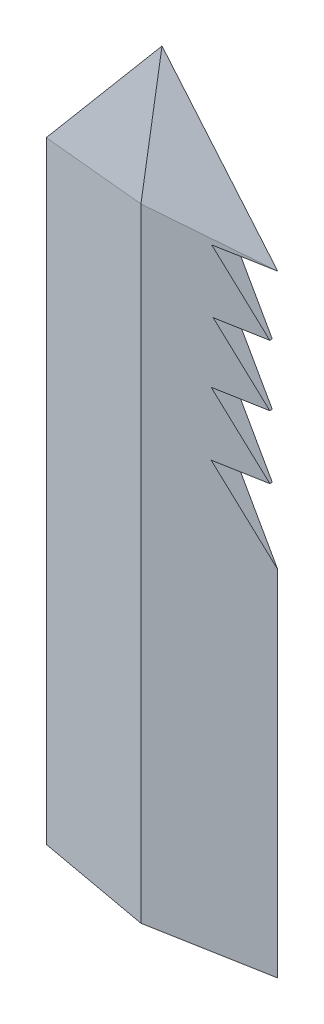
ISO-10303-21;
HEADER;
FILE_DESCRIPTION(('STEP AP214'),'2;1');
FILE_NAME('part.step','',(''),(''),'','','');
FILE_SCHEMA(('AUTOMOTIVE_DESIGN { 1 0 10303 214 1 1 1 1 }'));
ENDSEC;
DATA;
#1=APPLICATION_CONTEXT('core data for automotive mechanical design processes');
#2=APPLICATION_PROTOCOL_DEFINITION('international standard','automotive_design',2000,#1);
#3=PRODUCT_CONTEXT('',#1,'mechanical');
#4=PRODUCT('Part','Part','',(#3));
#5=PRODUCT_RELATED_PRODUCT_CATEGORY('part','',(#4));
#6=PRODUCT_DEFINITION_FORMATION('','',#4);
#7=PRODUCT_DEFINITION_CONTEXT('part definition',#1,'design');
#8=PRODUCT_DEFINITION('design','',#6,#7);
#9=PRODUCT_DEFINITION_SHAPE('','',#8);
#10=(LENGTH_UNIT() NAMED_UNIT(*) SI_UNIT(.MILLI.,.METRE.));
#11=(NAMED_UNIT(*) PLANE_ANGLE_UNIT() SI_UNIT($,.RADIAN.));
#12=(NAMED_UNIT(*) SI_UNIT($,.STERADIAN.) SOLID_ANGLE_UNIT());
#13=UNCERTAINTY_MEASURE_WITH_UNIT(LENGTH_MEASURE(1.E-05),#10,'distance_accuracy_value','');
#14=(GEOMETRIC_REPRESENTATION_CONTEXT(3) GLOBAL_UNCERTAINTY_ASSIGNED_CONTEXT((#13)) GLOBAL_UNIT_ASSIGNED_CONTEXT((#10,
#11,#12)) REPRESENTATION_CONTEXT('',''));
#15=CARTESIAN_POINT('',(0.,0.,0.));
#16=DIRECTION('',(0.,0.,1.));
#17=DIRECTION('',(1.,0.,0.));
#18=AXIS2_PLACEMENT_3D('',#15,#16,#17);
#19=CARTESIAN_POINT('',(49.4049114425268,735.656458749055,0.));
#20=DIRECTION('',(0.178885438199983,0.,0.983869910099907));
#21=DIRECTION('',(0.983869910099907,0.,-0.178885438199983));
#22=AXIS2_PLACEMENT_3D('',#19,#20,#21);
#23=PLANE('',#22);
#24=DIRECTION('',(0.,-1.,0.));
#25=VECTOR('',#24,1.);
#26=CARTESIAN_POINT('',(49.4049114425268,735.656458749055,0.));
#27=LINE('',#26,#25);
#28=CARTESIAN_POINT('',(49.4049114425268,673.557276223925,0.));
#29=VERTEX_POINT('',#28);
#30=CARTESIAN_POINT('',(49.4049114425268,396.497366015123,0.));
#31=VERTEX_POINT('',#30);
#32=EDGE_CURVE('E138',#29,#31,#27,.T.);
#33=ORIENTED_EDGE('',*,*,#32,.F.);
#34=DIRECTION('',(0.979647196162133,0.0925498026063238,-0.178117672029479));
#35=VECTOR('',#34,1.);
#36=CARTESIAN_POINT('',(55.0352055276626,674.089184658141,-1.02368983366106));
#37=LINE('',#36,#35);
#38=CARTESIAN_POINT('',(101.792411442527,678.506458749055,-9.52499999999999));
#39=VERTEX_POINT('',#38);
#40=EDGE_CURVE('E126',#29,#39,#37,.T.);
#41=ORIENTED_EDGE('',*,*,#40,.T.);
#42=DIRECTION('',(0.,-1.,0.));
#43=VECTOR('',#42,1.);
#44=CARTESIAN_POINT('',(101.792411442527,735.656458749055,-9.525));
#45=LINE('',#44,#43);
#46=CARTESIAN_POINT('',(101.792411442527,396.497366015123,-9.525));
#47=VERTEX_POINT('',#46);
#48=EDGE_CURVE('E135',#39,#47,#45,.T.);
#49=ORIENTED_EDGE('',*,*,#48,.T.);
#50=DIRECTION('',(-0.983869910099908,0.,0.178885438199983));
#51=VECTOR('',#50,1.);
#52=CARTESIAN_POINT('',(49.4049114425268,396.497366015123,0.));
#53=LINE('',#52,#51);
#54=EDGE_CURVE('E155',#47,#31,#53,.T.);
#55=ORIENTED_EDGE('',*,*,#54,.T.);
#56=EDGE_LOOP('',(#33,#41,#49,#55));
#57=FACE_BOUND('',#56,.T.);
#58=ADVANCED_FACE('F33',(#57),#23,.F.);
#59=CARTESIAN_POINT('',(101.792411442527,735.656458749055,-9.525));
#60=DIRECTION('',(-0.178885438199983,0.,0.983869910099907));
#61=DIRECTION('',(0.983869910099907,0.,0.178885438199983));
#62=AXIS2_PLACEMENT_3D('',#59,#60,#61);
#63=PLANE('',#62);
#64=DIRECTION('',(-0.979647196162133,0.092549802606325,-0.178117672029479));
#65=VECTOR('',#64,1.);
#66=CARTESIAN_POINT('',(96.6108407054998,678.995975128811,-10.4671037703685));
#67=LINE('',#66,#65);
#68=CARTESIAN_POINT('',(154.179911442527,673.557276223925,0.));
#69=VERTEX_POINT('',#68);
#70=EDGE_CURVE('E139',#69,#39,#67,.T.);
#71=ORIENTED_EDGE('',*,*,#70,.F.);
#72=DIRECTION('',(-0.983869910099908,0.,-0.178885438199983));
#73=VECTOR('',#72,1.);
#74=CARTESIAN_POINT('',(152.503511442527,673.557276223924,-0.304799999999994));
#75=LINE('',#74,#73);
#76=CARTESIAN_POINT('',(128.876006432521,673.557276223924,-4.60071000181918));
#77=VERTEX_POINT('',#76);
#78=EDGE_CURVE('E173',#69,#77,#75,.T.);
#79=ORIENTED_EDGE('',*,*,#78,.T.);
#80=DIRECTION('',(0.614220244823665,-0.781192595146374,0.111676408149757));
#81=VECTOR('',#80,1.);
#82=CARTESIAN_POINT('',(128.538230123855,673.986875139573,-4.66212387612206));
#83=LINE('',#82,#81);
#84=CARTESIAN_POINT('',(151.148766449185,645.229790529464,-0.551117271516697));
#85=VERTEX_POINT('',#84);
#86=EDGE_CURVE('E171',#77,#85,#83,.T.);
#87=ORIENTED_EDGE('',*,*,#86,.T.);
#88=DIRECTION('',(-0.983869910099908,0.,-0.178885438199983));
#89=VECTOR('',#88,1.);
#90=CARTESIAN_POINT('',(149.569363088972,645.229790529464,-0.838281518828162));
#91=LINE('',#90,#89);
#92=CARTESIAN_POINT('',(129.452026088125,645.229790529464,-4.49597915534583));
#93=VERTEX_POINT('',#92);
#94=EDGE_CURVE('E169',#85,#93,#91,.T.);
#95=ORIENTED_EDGE('',*,*,#94,.T.);
#96=DIRECTION('',(0.614220244823665,-0.781192595146374,0.111676408149757));
#97=VECTOR('',#96,1.);
#98=CARTESIAN_POINT('',(129.107065881123,645.668526246174,-4.55869919298257));
#99=LINE('',#98,#97);
#100=CARTESIAN_POINT('',(151.148766449185,617.634912223655,-0.551117271516697));
#101=VERTEX_POINT('',#100);
#102=EDGE_CURVE('E167',#93,#101,#99,.T.);
#103=ORIENTED_EDGE('',*,*,#102,.T.);
#104=DIRECTION('',(-0.983869910099908,0.,-0.178885438199983));
#105=VECTOR('',#104,1.);
#106=CARTESIAN_POINT('',(149.569363088972,617.634912223655,-0.838281518828162));
#107=LINE('',#106,#105);
#108=CARTESIAN_POINT('',(128.683999880654,617.634912223655,-4.63562028397697));
#109=VERTEX_POINT('',#108);
#110=EDGE_CURVE('E165',#101,#109,#107,.T.);
#111=ORIENTED_EDGE('',*,*,#110,.T.);
#112=DIRECTION('',(0.614220244823665,-0.781192595146374,0.111676408149757));
#113=VECTOR('',#112,1.);
#114=CARTESIAN_POINT('',(128.348618204766,618.06146553895,-4.69659877050188));
#115=LINE('',#114,#113);
#116=CARTESIAN_POINT('',(151.148766449185,589.063224066312,-0.551117271516697));
#117=VERTEX_POINT('',#116);
#118=EDGE_CURVE('E163',#109,#117,#115,.T.);
#119=ORIENTED_EDGE('',*,*,#118,.T.);
#120=DIRECTION('',(-0.983869910099908,0.,-0.178885438199983));
#121=VECTOR('',#120,1.);
#122=CARTESIAN_POINT('',(149.569363088972,589.063224066312,-0.838281518828162));
#123=LINE('',#122,#121);
#124=CARTESIAN_POINT('',(128.683999880654,589.063224066312,-4.63562028397697));
#125=VERTEX_POINT('',#124);
#126=EDGE_CURVE('E157',#117,#125,#123,.T.);
#127=ORIENTED_EDGE('',*,*,#126,.T.);
#128=DIRECTION('',(0.614220244823665,-0.781192595146374,0.111676408149757));
#129=VECTOR('',#128,1.);
#130=CARTESIAN_POINT('',(128.348618204766,589.489777381607,-4.69659877050188));
#131=LINE('',#130,#129);
#132=CARTESIAN_POINT('',(154.179911442527,556.636391042662,0.));
#133=VERTEX_POINT('',#132);
#134=EDGE_CURVE('E154',#125,#133,#131,.T.);
#135=ORIENTED_EDGE('',*,*,#134,.T.);
#136=DIRECTION('',(0.,-1.,0.));
#137=VECTOR('',#136,1.);
#138=CARTESIAN_POINT('',(154.179911442527,735.656458749055,0.));
#139=LINE('',#138,#137);
#140=CARTESIAN_POINT('',(154.179911442527,396.497366015123,0.));
#141=VERTEX_POINT('',#140);
#142=EDGE_CURVE('E181',#133,#141,#139,.T.);
#143=ORIENTED_EDGE('',*,*,#142,.T.);
#144=DIRECTION('',(-0.983869910099907,0.,-0.178885438199983));
#145=VECTOR('',#144,1.);
#146=CARTESIAN_POINT('',(101.792411442527,396.497366015123,-9.525));
#147=LINE('',#146,#145);
#148=EDGE_CURVE('E152',#141,#47,#147,.T.);
#149=ORIENTED_EDGE('',*,*,#148,.T.);
#150=ORIENTED_EDGE('',*,*,#48,.F.);
#151=EDGE_LOOP('',(#71,#79,#87,#95,#103,#111,#119,#127,#135,#143,#149,#150));
#152=FACE_BOUND('',#151,.T.);
#153=ADVANCED_FACE('F150',(#152),#63,.F.);
#154=CARTESIAN_POINT('',(101.792411442527,735.656458749055,9.525));
#155=DIRECTION('',(-0.178885438199983,0.,-0.983869910099907));
#156=DIRECTION('',(-0.983869910099907,0.,0.178885438199983));
#157=AXIS2_PLACEMENT_3D('',#154,#155,#156);
#158=PLANE('',#157);
#159=DIRECTION('',(0.979647196162133,-0.0925498026063245,-0.178117672029479));
#160=VECTOR('',#159,1.);
#161=CARTESIAN_POINT('',(96.6108407054998,678.995975128811,10.4671037703685));
#162=LINE('',#161,#160);
#163=CARTESIAN_POINT('',(101.792411442527,678.506458749055,9.525));
#164=VERTEX_POINT('',#163);
#165=EDGE_CURVE('E226',#164,#69,#162,.T.);
#166=ORIENTED_EDGE('',*,*,#165,.F.);
#167=DIRECTION('',(0.,-1.,0.));
#168=VECTOR('',#167,1.);
#169=CARTESIAN_POINT('',(101.792411442527,735.656458749055,9.525));
#170=LINE('',#169,#168);
#171=CARTESIAN_POINT('',(101.792411442527,396.497366015123,9.525));
#172=VERTEX_POINT('',#171);
#173=EDGE_CURVE('E184',#164,#172,#170,.T.);
#174=ORIENTED_EDGE('',*,*,#173,.T.);
#175=DIRECTION('',(0.983869910099908,0.,-0.178885438199983));
#176=VECTOR('',#175,1.);
#177=CARTESIAN_POINT('',(101.792411442527,396.497366015123,9.525));
#178=LINE('',#177,#176);
#179=EDGE_CURVE('E178',#172,#141,#178,.T.);
#180=ORIENTED_EDGE('',*,*,#179,.T.);
#181=ORIENTED_EDGE('',*,*,#142,.F.);
#182=DIRECTION('',(-0.614220244823665,0.781192595146374,0.111676408149757));
#183=VECTOR('',#182,1.);
#184=CARTESIAN_POINT('',(129.655332204645,587.827840463568,4.45901440688762));
#185=LINE('',#184,#183);
#186=CARTESIAN_POINT('',(128.683999880654,589.063224066312,4.63562028397696));
#187=VERTEX_POINT('',#186);
#188=EDGE_CURVE('E183',#133,#187,#185,.T.);
#189=ORIENTED_EDGE('',*,*,#188,.T.);
#190=DIRECTION('',(0.983869910099908,0.,-0.178885438199983));
#191=VECTOR('',#190,1.);
#192=CARTESIAN_POINT('',(152.922163088972,589.063224066312,0.228681518828154));
#193=LINE('',#192,#191);
#194=CARTESIAN_POINT('',(151.148766449185,589.063224066312,0.551117271516686));
#195=VERTEX_POINT('',#194);
#196=EDGE_CURVE('E189',#187,#195,#193,.T.);
#197=ORIENTED_EDGE('',*,*,#196,.T.);
#198=DIRECTION('',(-0.614220244823665,0.781192595146374,0.111676408149757));
#199=VECTOR('',#198,1.);
#200=CARTESIAN_POINT('',(129.655332204645,616.399528620911,4.45901440688762));
#201=LINE('',#200,#199);
#202=CARTESIAN_POINT('',(128.683999880653,617.634912223655,4.63562028397696));
#203=VERTEX_POINT('',#202);
#204=EDGE_CURVE('E192',#195,#203,#201,.T.);
#205=ORIENTED_EDGE('',*,*,#204,.T.);
#206=DIRECTION('',(0.983869910099908,0.,-0.178885438199983));
#207=VECTOR('',#206,1.);
#208=CARTESIAN_POINT('',(152.922163088972,617.634912223655,0.228681518828154));
#209=LINE('',#208,#207);
#210=CARTESIAN_POINT('',(151.148766449185,617.634912223655,0.551117271516686));
#211=VERTEX_POINT('',#210);
#212=EDGE_CURVE('E195',#203,#211,#209,.T.);
#213=ORIENTED_EDGE('',*,*,#212,.T.);
#214=DIRECTION('',(-0.614220244823665,0.781192595146374,0.111676408149757));
#215=VECTOR('',#214,1.);
#216=CARTESIAN_POINT('',(130.413779881001,644.006589328136,4.32111482936831));
#217=LINE('',#216,#215);
#218=CARTESIAN_POINT('',(129.452026088125,645.229790529464,4.49597915534583));
#219=VERTEX_POINT('',#218);
#220=EDGE_CURVE('E198',#211,#219,#217,.T.);
#221=ORIENTED_EDGE('',*,*,#220,.T.);
#222=DIRECTION('',(0.983869910099908,0.,-0.178885438199983));
#223=VECTOR('',#222,1.);
#224=CARTESIAN_POINT('',(152.922163088972,645.229790529464,0.228681518828154));
#225=LINE('',#224,#223);
#226=CARTESIAN_POINT('',(151.148766449185,645.229790529464,0.551117271516686));
#227=VERTEX_POINT('',#226);
#228=EDGE_CURVE('E201',#219,#227,#225,.T.);
#229=ORIENTED_EDGE('',*,*,#228,.T.);
#230=DIRECTION('',(-0.614220244823665,0.781192595146374,0.111676408149757));
#231=VECTOR('',#230,1.);
#232=CARTESIAN_POINT('',(129.844944123734,672.324938221534,4.4245395125078));
#233=LINE('',#232,#231);
#234=CARTESIAN_POINT('',(128.876006432521,673.557276223924,4.60071000181918));
#235=VERTEX_POINT('',#234);
#236=EDGE_CURVE('E203',#227,#235,#233,.T.);
#237=ORIENTED_EDGE('',*,*,#236,.T.);
#238=DIRECTION('',(0.983869910099908,0.,-0.178885438199983));
#239=VECTOR('',#238,1.);
#240=CARTESIAN_POINT('',(155.856311442527,673.557276223924,-0.304800000000015));
#241=LINE('',#240,#239);
#242=EDGE_CURVE('E205',#235,#69,#241,.T.);
#243=ORIENTED_EDGE('',*,*,#242,.T.);
#244=EDGE_LOOP('',(#166,#174,#180,#181,#189,#197,#205,#213,#221,#229,#237,#243));
#245=FACE_BOUND('',#244,.T.);
#246=ADVANCED_FACE('F256',(#245),#158,.F.);
#247=CARTESIAN_POINT('',(49.4049114425268,735.656458749055,0.));
#248=DIRECTION('',(0.178885438199983,0.,-0.983869910099907));
#249=DIRECTION('',(-0.983869910099907,0.,-0.178885438199983));
#250=AXIS2_PLACEMENT_3D('',#247,#248,#249);
#251=PLANE('',#250);
#252=ORIENTED_EDGE('',*,*,#173,.F.);
#253=DIRECTION('',(-0.979647196162133,-0.0925498026063228,-0.178117672029479));
#254=VECTOR('',#253,1.);
#255=CARTESIAN_POINT('',(55.0352055276626,674.089184658141,1.02368983366104));
#256=LINE('',#255,#254);
#257=EDGE_CURVE('E148',#164,#29,#256,.T.);
#258=ORIENTED_EDGE('',*,*,#257,.T.);
#259=ORIENTED_EDGE('',*,*,#32,.T.);
#260=DIRECTION('',(0.983869910099907,0.,0.178885438199983));
#261=VECTOR('',#260,1.);
#262=CARTESIAN_POINT('',(49.4049114425268,396.497366015123,0.));
#263=LINE('',#262,#261);
#264=EDGE_CURVE('E175',#31,#172,#263,.T.);
#265=ORIENTED_EDGE('',*,*,#264,.T.);
#266=EDGE_LOOP('',(#252,#258,#259,#265));
#267=FACE_BOUND('',#266,.T.);
#268=ADVANCED_FACE('F254',(#267),#251,.F.);
#269=CARTESIAN_POINT('',(154.179911442527,673.557276223924,-9.525));
#270=DIRECTION('',(0.,-1.,0.));
#271=DIRECTION('',(0.,0.,-1.));
#272=AXIS2_PLACEMENT_3D('',#269,#270,#271);
#273=PLANE('',#272);
#274=ORIENTED_EDGE('',*,*,#78,.F.);
#275=ORIENTED_EDGE('',*,*,#242,.F.);
#276=DIRECTION('',(0.,0.,1.));
#277=VECTOR('',#276,1.);
#278=CARTESIAN_POINT('',(128.876006432521,673.557276223924,-9.525));
#279=LINE('',#278,#277);
#280=EDGE_CURVE('E48',#77,#235,#279,.T.);
#281=ORIENTED_EDGE('',*,*,#280,.F.);
#282=EDGE_LOOP('',(#274,#275,#281));
#283=FACE_BOUND('',#282,.T.);
#284=ADVANCED_FACE('F260',(#283),#273,.T.);
#285=CARTESIAN_POINT('',(128.876006432521,673.557276223924,-9.525));
#286=DIRECTION('',(0.786110007979643,0.618086608295509,0.));
#287=DIRECTION('',(-0.618086608295509,0.786110007979643,0.));
#288=AXIS2_PLACEMENT_3D('',#285,#286,#287);
#289=PLANE('',#288);
#290=ORIENTED_EDGE('',*,*,#86,.F.);
#291=ORIENTED_EDGE('',*,*,#280,.T.);
#292=ORIENTED_EDGE('',*,*,#236,.F.);
#293=DIRECTION('',(0.,0.,1.));
#294=VECTOR('',#293,1.);
#295=CARTESIAN_POINT('',(151.148766449185,645.229790529464,-9.525));
#296=LINE('',#295,#294);
#297=EDGE_CURVE('E56',#85,#227,#296,.T.);
#298=ORIENTED_EDGE('',*,*,#297,.F.);
#299=EDGE_LOOP('',(#290,#291,#292,#298));
#300=FACE_BOUND('',#299,.T.);
#301=ADVANCED_FACE('F261',(#300),#289,.T.);
#302=CARTESIAN_POINT('',(151.148766449185,645.229790529464,-9.525));
#303=DIRECTION('',(0.,-1.,0.));
#304=DIRECTION('',(0.,0.,-1.));
#305=AXIS2_PLACEMENT_3D('',#302,#303,#304);
#306=PLANE('',#305);
#307=ORIENTED_EDGE('',*,*,#94,.F.);
#308=ORIENTED_EDGE('',*,*,#297,.T.);
#309=ORIENTED_EDGE('',*,*,#228,.F.);
#310=DIRECTION('',(0.,0.,1.));
#311=VECTOR('',#310,1.);
#312=CARTESIAN_POINT('',(129.452026088125,645.229790529464,-9.525));
#313=LINE('',#312,#311);
#314=EDGE_CURVE('E211',#93,#219,#313,.T.);
#315=ORIENTED_EDGE('',*,*,#314,.F.);
#316=EDGE_LOOP('',(#307,#308,#309,#315));
#317=FACE_BOUND('',#316,.T.);
#318=ADVANCED_FACE('F263',(#317),#306,.T.);
#319=CARTESIAN_POINT('',(129.452026088125,645.229790529464,-9.525));
#320=DIRECTION('',(0.786110007979643,0.61808660829551,0.));
#321=DIRECTION('',(-0.61808660829551,0.786110007979642,0.));
#322=AXIS2_PLACEMENT_3D('',#319,#320,#321);
#323=PLANE('',#322);
#324=ORIENTED_EDGE('',*,*,#102,.F.);
#325=ORIENTED_EDGE('',*,*,#314,.T.);
#326=ORIENTED_EDGE('',*,*,#220,.F.);
#327=DIRECTION('',(0.,0.,1.));
#328=VECTOR('',#327,1.);
#329=CARTESIAN_POINT('',(151.148766449185,617.634912223655,-9.525));
#330=LINE('',#329,#328);
#331=EDGE_CURVE('E213',#101,#211,#330,.T.);
#332=ORIENTED_EDGE('',*,*,#331,.F.);
#333=EDGE_LOOP('',(#324,#325,#326,#332));
#334=FACE_BOUND('',#333,.T.);
#335=ADVANCED_FACE('F269',(#334),#323,.T.);
#336=CARTESIAN_POINT('',(151.148766449185,617.634912223655,-9.525));
#337=DIRECTION('',(0.,-1.,0.));
#338=DIRECTION('',(0.,0.,-1.));
#339=AXIS2_PLACEMENT_3D('',#336,#337,#338);
#340=PLANE('',#339);
#341=ORIENTED_EDGE('',*,*,#110,.F.);
#342=ORIENTED_EDGE('',*,*,#331,.T.);
#343=ORIENTED_EDGE('',*,*,#212,.F.);
#344=DIRECTION('',(0.,0.,1.));
#345=VECTOR('',#344,1.);
#346=CARTESIAN_POINT('',(128.683999880654,617.634912223655,-9.525));
#347=LINE('',#346,#345);
#348=EDGE_CURVE('E215',#109,#203,#347,.T.);
#349=ORIENTED_EDGE('',*,*,#348,.F.);
#350=EDGE_LOOP('',(#341,#342,#343,#349));
#351=FACE_BOUND('',#350,.T.);
#352=ADVANCED_FACE('F369',(#351),#340,.T.);
#353=CARTESIAN_POINT('',(128.683999880654,617.634912223655,-9.525));
#354=DIRECTION('',(0.786110007979642,0.61808660829551,0.));
#355=DIRECTION('',(-0.61808660829551,0.786110007979642,0.));
#356=AXIS2_PLACEMENT_3D('',#353,#354,#355);
#357=PLANE('',#356);
#358=ORIENTED_EDGE('',*,*,#118,.F.);
#359=ORIENTED_EDGE('',*,*,#348,.T.);
#360=ORIENTED_EDGE('',*,*,#204,.F.);
#361=DIRECTION('',(0.,0.,1.));
#362=VECTOR('',#361,1.);
#363=CARTESIAN_POINT('',(151.148766449185,589.063224066312,-9.525));
#364=LINE('',#363,#362);
#365=EDGE_CURVE('E217',#117,#195,#364,.T.);
#366=ORIENTED_EDGE('',*,*,#365,.F.);
#367=EDGE_LOOP('',(#358,#359,#360,#366));
#368=FACE_BOUND('',#367,.T.);
#369=ADVANCED_FACE('F361',(#368),#357,.T.);
#370=CARTESIAN_POINT('',(151.148766449185,589.063224066312,-9.525));
#371=DIRECTION('',(0.,-1.,0.));
#372=DIRECTION('',(0.,0.,-1.));
#373=AXIS2_PLACEMENT_3D('',#370,#371,#372);
#374=PLANE('',#373);
#375=ORIENTED_EDGE('',*,*,#126,.F.);
#376=ORIENTED_EDGE('',*,*,#365,.T.);
#377=ORIENTED_EDGE('',*,*,#196,.F.);
#378=DIRECTION('',(0.,0.,1.));
#379=VECTOR('',#378,1.);
#380=CARTESIAN_POINT('',(128.683999880654,589.063224066312,-9.525));
#381=LINE('',#380,#379);
#382=EDGE_CURVE('E208',#125,#187,#381,.T.);
#383=ORIENTED_EDGE('',*,*,#382,.F.);
#384=EDGE_LOOP('',(#375,#376,#377,#383));
#385=FACE_BOUND('',#384,.T.);
#386=ADVANCED_FACE('F355',(#385),#374,.T.);
#387=CARTESIAN_POINT('',(128.683999880654,589.063224066312,-9.525));
#388=DIRECTION('',(0.786110007979643,0.618086608295509,0.));
#389=DIRECTION('',(-0.618086608295509,0.786110007979643,0.));
#390=AXIS2_PLACEMENT_3D('',#387,#388,#389);
#391=PLANE('',#390);
#392=ORIENTED_EDGE('',*,*,#134,.F.);
#393=ORIENTED_EDGE('',*,*,#382,.T.);
#394=ORIENTED_EDGE('',*,*,#188,.F.);
#395=EDGE_LOOP('',(#392,#393,#394));
#396=FACE_BOUND('',#395,.T.);
#397=ADVANCED_FACE('F249',(#396),#391,.T.);
#398=CARTESIAN_POINT('',(49.4049114425268,396.497366015123,-9.525));
#399=DIRECTION('',(0.,-1.,0.));
#400=DIRECTION('',(0.,0.,-1.));
#401=AXIS2_PLACEMENT_3D('',#398,#399,#400);
#402=PLANE('',#401);
#403=CARTESIAN_POINT('',(101.792411442527,396.497366015123,0.));
#404=DIRECTION('',(0.,-1.,0.));
#405=DIRECTION('',(0.,0.,-1.));
#406=AXIS2_PLACEMENT_3D('',#403,#404,#405);
#407=CIRCLE('',#406,4.7625);
#408=CARTESIAN_POINT('',(101.792411442527,396.497366015123,-4.7625));
#409=VERTEX_POINT('',#408);
#410=EDGE_CURVE('E233',#409,#409,#407,.T.);
#411=ORIENTED_EDGE('',*,*,#410,.F.);
#412=EDGE_LOOP('',(#411));
#413=FACE_BOUND('',#412,.T.);
#414=ORIENTED_EDGE('',*,*,#54,.F.);
#415=ORIENTED_EDGE('',*,*,#148,.F.);
#416=ORIENTED_EDGE('',*,*,#179,.F.);
#417=ORIENTED_EDGE('',*,*,#264,.F.);
#418=EDGE_LOOP('',(#414,#415,#416,#417));
#419=FACE_BOUND('',#418,.T.);
#420=ADVANCED_FACE('F35',(#413,#419),#402,.T.);
#421=CARTESIAN_POINT('',(26.4304595608884,22.2970036632238,133.782021979343));
#422=DIRECTION('',(0.191277369739479,0.161363528467896,0.968181170807374));
#423=DIRECTION('',(0.98103763388137,0.,-0.193817339029417));
#424=AXIS2_PLACEMENT_3D('',#421,#422,#423);
#425=PLANE('',#424);
#426=DIRECTION('',(0.,0.986393923832144,-0.164398987305356));
#427=VECTOR('',#426,1.);
#428=CARTESIAN_POINT('',(101.79241144253,19.882606993218,119.295641959305));
#429=LINE('',#428,#427);
#430=CARTESIAN_POINT('',(101.792411442527,735.656458749055,1.66533453693773E-13));
#431=VERTEX_POINT('',#430);
#432=EDGE_CURVE('E41',#164,#431,#429,.T.);
#433=ORIENTED_EDGE('',*,*,#432,.F.);
#434=ORIENTED_EDGE('',*,*,#165,.T.);
#435=DIRECTION('',(0.644808491187796,-0.764344169659269,0.));
#436=VECTOR('',#435,1.);
#437=CARTESIAN_POINT('',(154.179911442527,673.557276223924,0.));
#438=LINE('',#437,#436);
#439=EDGE_CURVE('E145',#431,#69,#438,.T.);
#440=ORIENTED_EDGE('',*,*,#439,.F.);
#441=EDGE_LOOP('',(#433,#434,#440));
#442=FACE_BOUND('',#441,.T.);
#443=ADVANCED_FACE('F225',(#442),#425,.T.);
#444=CARTESIAN_POINT('',(-18.9818950957623,16.0133191596654,96.0799149579938));
#445=DIRECTION('',(0.191277369739479,-0.161363528467894,-0.968181170807374));
#446=DIRECTION('',(-0.98103763388137,0.,-0.193817339029416));
#447=AXIS2_PLACEMENT_3D('',#444,#445,#446);
#448=PLANE('',#447);
#449=DIRECTION('',(-0.644808491187796,-0.764344169659269,0.));
#450=VECTOR('',#449,1.);
#451=CARTESIAN_POINT('',(101.792411442527,735.656458749055,2.30718222304915E-13));
#452=LINE('',#451,#450);
#453=EDGE_CURVE('E128',#431,#29,#452,.T.);
#454=ORIENTED_EDGE('',*,*,#453,.T.);
#455=ORIENTED_EDGE('',*,*,#257,.F.);
#456=ORIENTED_EDGE('',*,*,#432,.T.);
#457=EDGE_LOOP('',(#454,#455,#456));
#458=FACE_BOUND('',#457,.T.);
#459=ADVANCED_FACE('F221',(#458),#448,.F.);
#460=CARTESIAN_POINT('',(26.4304595608884,22.2970036632238,-133.782021979343));
#461=DIRECTION('',(0.191277369739479,0.161363528467896,-0.968181170807374));
#462=DIRECTION('',(0.98103763388137,0.,0.193817339029417));
#463=AXIS2_PLACEMENT_3D('',#460,#461,#462);
#464=PLANE('',#463);
#465=DIRECTION('',(0.,-0.986393923832144,-0.164398987305356));
#466=VECTOR('',#465,1.);
#467=CARTESIAN_POINT('',(101.79241144253,19.882606993218,-119.295641959305));
#468=LINE('',#467,#466);
#469=EDGE_CURVE('E11',#431,#39,#468,.T.);
#470=ORIENTED_EDGE('',*,*,#469,.F.);
#471=ORIENTED_EDGE('',*,*,#439,.T.);
#472=ORIENTED_EDGE('',*,*,#70,.T.);
#473=EDGE_LOOP('',(#470,#471,#472));
#474=FACE_BOUND('',#473,.T.);
#475=ADVANCED_FACE('F143',(#474),#464,.T.);
#476=CARTESIAN_POINT('',(-18.9818950957623,16.0133191596654,-96.0799149579938));
#477=DIRECTION('',(0.191277369739479,-0.161363528467894,0.968181170807374));
#478=DIRECTION('',(-0.98103763388137,0.,0.193817339029416));
#479=AXIS2_PLACEMENT_3D('',#476,#477,#478);
#480=PLANE('',#479);
#481=ORIENTED_EDGE('',*,*,#453,.F.);
#482=ORIENTED_EDGE('',*,*,#469,.T.);
#483=ORIENTED_EDGE('',*,*,#40,.F.);
#484=EDGE_LOOP('',(#481,#482,#483));
#485=FACE_BOUND('',#484,.T.);
#486=ADVANCED_FACE('F125',(#485),#480,.F.);
#487=CARTESIAN_POINT('',(101.792411442527,650.497366015123,0.));
#488=DIRECTION('',(0.,-1.,0.));
#489=DIRECTION('',(0.,0.,-1.));
#490=AXIS2_PLACEMENT_3D('',#487,#488,#489);
#491=CYLINDRICAL_SURFACE('',#490,4.7625);
#492=CARTESIAN_POINT('',(101.792411442527,650.497366015123,0.));
#493=DIRECTION('',(0.,-1.,0.));
#494=DIRECTION('',(0.,0.,-1.));
#495=AXIS2_PLACEMENT_3D('',#492,#493,#494);
#496=CIRCLE('',#495,4.7625);
#497=CARTESIAN_POINT('',(101.792411442527,650.497366015123,-4.7625));
#498=VERTEX_POINT('',#497);
#499=EDGE_CURVE('E140',#498,#498,#496,.T.);
#500=ORIENTED_EDGE('',*,*,#499,.F.);
#501=EDGE_LOOP('',(#500));
#502=FACE_BOUND('',#501,.T.);
#503=ORIENTED_EDGE('',*,*,#410,.T.);
#504=EDGE_LOOP('',(#503));
#505=FACE_BOUND('',#504,.T.);
#506=ADVANCED_FACE('F241',(#502,#505),#491,.F.);
#507=CARTESIAN_POINT('',(101.792411442527,650.497366015123,0.));
#508=DIRECTION('',(0.,-1.,0.));
#509=DIRECTION('',(0.,0.,-1.));
#510=AXIS2_PLACEMENT_3D('',#507,#508,#509);
#511=PLANE('',#510);
#512=ORIENTED_EDGE('',*,*,#499,.T.);
#513=EDGE_LOOP('',(#512));
#514=FACE_BOUND('',#513,.T.);
#515=ADVANCED_FACE('F239',(#514),#511,.T.);
#516=CLOSED_SHELL('',(#58,#153,#246,#268,#284,#301,#318,#335,#352,#369,#386,#397,#420,#443,#459,
#475,#486,#506,#515));
#517=MANIFOLD_SOLID_BREP('B2',#516);
#518=ADVANCED_BREP_SHAPE_REPRESENTATION('',(#18,#517),#14);
#519=SHAPE_DEFINITION_REPRESENTATION(#9,#518);
ENDSEC;
END-ISO-10303-21;
